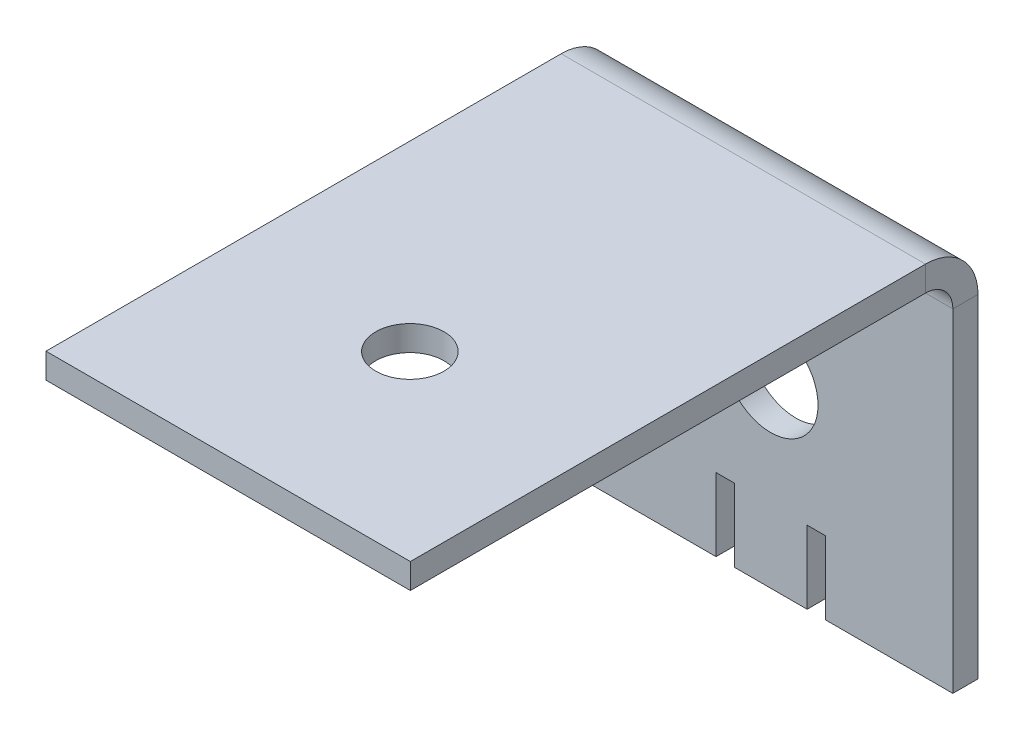
ISO-10303-21;
HEADER;
FILE_DESCRIPTION(('STEP AP214'),'2;1');
FILE_NAME('part.step','',(''),(''),'','','');
FILE_SCHEMA(('AUTOMOTIVE_DESIGN { 1 0 10303 214 1 1 1 1 }'));
ENDSEC;
DATA;
#1=APPLICATION_CONTEXT('core data for automotive mechanical design processes');
#2=APPLICATION_PROTOCOL_DEFINITION('international standard','automotive_design',2000,#1);
#3=PRODUCT_CONTEXT('',#1,'mechanical');
#4=PRODUCT('Part','Part','',(#3));
#5=PRODUCT_RELATED_PRODUCT_CATEGORY('part','',(#4));
#6=PRODUCT_DEFINITION_FORMATION('','',#4);
#7=PRODUCT_DEFINITION_CONTEXT('part definition',#1,'design');
#8=PRODUCT_DEFINITION('design','',#6,#7);
#9=PRODUCT_DEFINITION_SHAPE('','',#8);
#10=(LENGTH_UNIT() NAMED_UNIT(*) SI_UNIT(.MILLI.,.METRE.));
#11=(NAMED_UNIT(*) PLANE_ANGLE_UNIT() SI_UNIT($,.RADIAN.));
#12=(NAMED_UNIT(*) SI_UNIT($,.STERADIAN.) SOLID_ANGLE_UNIT());
#13=UNCERTAINTY_MEASURE_WITH_UNIT(LENGTH_MEASURE(1.E-05),#10,'distance_accuracy_value','');
#14=(GEOMETRIC_REPRESENTATION_CONTEXT(3) GLOBAL_UNCERTAINTY_ASSIGNED_CONTEXT((#13)) GLOBAL_UNIT_ASSIGNED_CONTEXT((#10,
#11,#12)) REPRESENTATION_CONTEXT('',''));
#15=CARTESIAN_POINT('',(0.,0.,0.));
#16=DIRECTION('',(0.,0.,1.));
#17=DIRECTION('',(1.,0.,0.));
#18=AXIS2_PLACEMENT_3D('',#15,#16,#17);
#19=CARTESIAN_POINT('',(0.,0.,-1.7526));
#20=DIRECTION('',(-1.,0.,0.));
#21=DIRECTION('',(0.,0.,1.));
#22=AXIS2_PLACEMENT_3D('',#19,#20,#21);
#23=PLANE('',#22);
#24=DIRECTION('',(0.,0.,1.));
#25=VECTOR('',#24,1.);
#26=CARTESIAN_POINT('',(0.,15.24,-8.93680489685532));
#27=LINE('',#26,#25);
#28=CARTESIAN_POINT('',(0.,15.24,-1.7526));
#29=VERTEX_POINT('',#28);
#30=CARTESIAN_POINT('',(0.,15.24,0.));
#31=VERTEX_POINT('',#30);
#32=EDGE_CURVE('E208',#29,#31,#27,.T.);
#33=ORIENTED_EDGE('',*,*,#32,.T.);
#34=DIRECTION('',(0.,-1.,0.));
#35=VECTOR('',#34,1.);
#36=CARTESIAN_POINT('',(0.,0.,0.));
#37=LINE('',#36,#35);
#38=CARTESIAN_POINT('',(0.,23.2155720881427,0.));
#39=VERTEX_POINT('',#38);
#40=EDGE_CURVE('E307',#39,#31,#37,.T.);
#41=ORIENTED_EDGE('',*,*,#40,.F.);
#42=DIRECTION('',(0.,0.,-1.));
#43=VECTOR('',#42,1.);
#44=CARTESIAN_POINT('',(0.,23.2155720881427,-1.75259999999984));
#45=LINE('',#44,#43);
#46=CARTESIAN_POINT('',(0.,23.2155720881427,-1.7526));
#47=VERTEX_POINT('',#46);
#48=EDGE_CURVE('E297',#39,#47,#45,.T.);
#49=ORIENTED_EDGE('',*,*,#48,.T.);
#50=DIRECTION('',(0.,-1.,0.));
#51=VECTOR('',#50,1.);
#52=CARTESIAN_POINT('',(0.,0.,-1.7526));
#53=LINE('',#52,#51);
#54=EDGE_CURVE('E70',#47,#29,#53,.T.);
#55=ORIENTED_EDGE('',*,*,#54,.T.);
#56=EDGE_LOOP('',(#33,#41,#49,#55));
#57=FACE_BOUND('',#56,.T.);
#58=ADVANCED_FACE('F45',(#57),#23,.T.);
#59=CARTESIAN_POINT('',(0.,0.,-1.7526));
#60=DIRECTION('',(0.,-1.,0.));
#61=DIRECTION('',(0.,0.,-1.));
#62=AXIS2_PLACEMENT_3D('',#59,#60,#61);
#63=PLANE('',#62);
#64=DIRECTION('',(0.,0.,1.));
#65=VECTOR('',#64,1.);
#66=CARTESIAN_POINT('',(10.16,0.,-1.7536));
#67=LINE('',#66,#65);
#68=CARTESIAN_POINT('',(10.16,0.,-1.7526));
#69=VERTEX_POINT('',#68);
#70=CARTESIAN_POINT('',(10.16,0.,0.));
#71=VERTEX_POINT('',#70);
#72=EDGE_CURVE('E234',#69,#71,#67,.T.);
#73=ORIENTED_EDGE('',*,*,#72,.F.);
#74=DIRECTION('',(1.,0.,0.));
#75=VECTOR('',#74,1.);
#76=CARTESIAN_POINT('',(0.,0.,-1.7526));
#77=LINE('',#76,#75);
#78=CARTESIAN_POINT('',(15.24,0.,-1.7526));
#79=VERTEX_POINT('',#78);
#80=EDGE_CURVE('E326',#69,#79,#77,.T.);
#81=ORIENTED_EDGE('',*,*,#80,.T.);
#82=DIRECTION('',(0.,0.,1.));
#83=VECTOR('',#82,1.);
#84=CARTESIAN_POINT('',(15.24,0.,-1.7536));
#85=LINE('',#84,#83);
#86=CARTESIAN_POINT('',(15.24,0.,0.));
#87=VERTEX_POINT('',#86);
#88=EDGE_CURVE('E264',#79,#87,#85,.T.);
#89=ORIENTED_EDGE('',*,*,#88,.T.);
#90=DIRECTION('',(1.,0.,0.));
#91=VECTOR('',#90,1.);
#92=CARTESIAN_POINT('',(0.,0.,0.));
#93=LINE('',#92,#91);
#94=EDGE_CURVE('E305',#71,#87,#93,.T.);
#95=ORIENTED_EDGE('',*,*,#94,.F.);
#96=EDGE_LOOP('',(#73,#81,#89,#95));
#97=FACE_BOUND('',#96,.T.);
#98=ADVANCED_FACE('F392',(#97),#63,.T.);
#99=DIRECTION('',(0.,0.,1.));
#100=VECTOR('',#99,1.);
#101=CARTESIAN_POINT('',(16.51,0.,-1.7536));
#102=LINE('',#101,#100);
#103=CARTESIAN_POINT('',(16.51,0.,-1.7526));
#104=VERTEX_POINT('',#103);
#105=CARTESIAN_POINT('',(16.51,0.,0.));
#106=VERTEX_POINT('',#105);
#107=EDGE_CURVE('E261',#104,#106,#102,.T.);
#108=ORIENTED_EDGE('',*,*,#107,.F.);
#109=CARTESIAN_POINT('',(25.4,0.,-1.7526));
#110=VERTEX_POINT('',#109);
#111=EDGE_CURVE('E327',#104,#110,#77,.T.);
#112=ORIENTED_EDGE('',*,*,#111,.T.);
#113=DIRECTION('',(0.,0.,1.));
#114=VECTOR('',#113,1.);
#115=CARTESIAN_POINT('',(25.4,0.,-1.7526));
#116=LINE('',#115,#114);
#117=CARTESIAN_POINT('',(25.4,0.,0.));
#118=VERTEX_POINT('',#117);
#119=EDGE_CURVE('E320',#110,#118,#116,.T.);
#120=ORIENTED_EDGE('',*,*,#119,.T.);
#121=EDGE_CURVE('E306',#106,#118,#93,.T.);
#122=ORIENTED_EDGE('',*,*,#121,.F.);
#123=EDGE_LOOP('',(#108,#112,#120,#122));
#124=FACE_BOUND('',#123,.T.);
#125=ADVANCED_FACE('F404',(#124),#63,.T.);
#126=CARTESIAN_POINT('',(0.,25.1205720881428,-25.6794279118573));
#127=DIRECTION('',(0.,1.,0.));
#128=DIRECTION('',(-1.,0.,0.));
#129=AXIS2_PLACEMENT_3D('',#126,#127,#128);
#130=PLANE('',#129);
#131=CARTESIAN_POINT('',(12.7,25.1205720881426,25.154382));
#132=DIRECTION('',(0.,1.,0.));
#133=DIRECTION('',(0.,0.,1.));
#134=AXIS2_PLACEMENT_3D('',#131,#132,#133);
#135=CIRCLE('',#134,2.38125);
#136=CARTESIAN_POINT('',(12.7,25.1205720881426,27.535632));
#137=VERTEX_POINT('',#136);
#138=EDGE_CURVE('E423',#137,#137,#135,.F.);
#139=ORIENTED_EDGE('',*,*,#138,.F.);
#140=EDGE_LOOP('',(#139));
#141=FACE_BOUND('',#140,.T.);
#142=DIRECTION('',(0.,0.,-1.));
#143=VECTOR('',#142,1.);
#144=CARTESIAN_POINT('',(0.,25.1205720881428,-25.6794279118573));
#145=LINE('',#144,#143);
#146=CARTESIAN_POINT('',(0.,25.1205720881426,37.8205720881427));
#147=VERTEX_POINT('',#146);
#148=CARTESIAN_POINT('',(0.,25.1205720881427,1.90499999999999));
#149=VERTEX_POINT('',#148);
#150=EDGE_CURVE('E294',#147,#149,#145,.T.);
#151=ORIENTED_EDGE('',*,*,#150,.T.);
#152=DIRECTION('',(1.,0.,0.));
#153=VECTOR('',#152,1.);
#154=CARTESIAN_POINT('',(0.,25.1205720881427,1.90499999999999));
#155=LINE('',#154,#153);
#156=CARTESIAN_POINT('',(25.4,25.1205720881427,1.90499999999999));
#157=VERTEX_POINT('',#156);
#158=EDGE_CURVE('E54',#149,#157,#155,.T.);
#159=ORIENTED_EDGE('',*,*,#158,.T.);
#160=DIRECTION('',(0.,0.,1.));
#161=VECTOR('',#160,1.);
#162=CARTESIAN_POINT('',(25.4,25.1205720881428,-25.6794279118573));
#163=LINE('',#162,#161);
#164=CARTESIAN_POINT('',(25.4,25.1205720881426,37.8205720881427));
#165=VERTEX_POINT('',#164);
#166=EDGE_CURVE('E338',#157,#165,#163,.T.);
#167=ORIENTED_EDGE('',*,*,#166,.T.);
#168=DIRECTION('',(-1.,0.,0.));
#169=VECTOR('',#168,1.);
#170=CARTESIAN_POINT('',(0.,25.1205720881426,37.8205720881427));
#171=LINE('',#170,#169);
#172=EDGE_CURVE('E334',#165,#147,#171,.T.);
#173=ORIENTED_EDGE('',*,*,#172,.T.);
#174=EDGE_LOOP('',(#151,#159,#167,#173));
#175=FACE_BOUND('',#174,.T.);
#176=ADVANCED_FACE('F356',(#141,#175),#130,.F.);
#177=CARTESIAN_POINT('',(0.,26.8731720881428,-25.6794279118573));
#178=DIRECTION('',(-1.,0.,0.));
#179=DIRECTION('',(0.,-1.,0.));
#180=AXIS2_PLACEMENT_3D('',#177,#178,#179);
#181=PLANE('',#180);
#182=DIRECTION('',(0.,1.,0.));
#183=VECTOR('',#182,1.);
#184=CARTESIAN_POINT('',(0.,26.8731720881425,1.90500000000001));
#185=LINE('',#184,#183);
#186=CARTESIAN_POINT('',(0.,26.8731720881427,1.90500000000001));
#187=VERTEX_POINT('',#186);
#188=EDGE_CURVE('E12',#149,#187,#185,.T.);
#189=ORIENTED_EDGE('',*,*,#188,.F.);
#190=ORIENTED_EDGE('',*,*,#150,.F.);
#191=DIRECTION('',(0.,-1.,0.));
#192=VECTOR('',#191,1.);
#193=CARTESIAN_POINT('',(0.,26.8731720881426,37.8205720881427));
#194=LINE('',#193,#192);
#195=CARTESIAN_POINT('',(0.,26.8731720881426,37.8205720881427));
#196=VERTEX_POINT('',#195);
#197=EDGE_CURVE('E339',#196,#147,#194,.T.);
#198=ORIENTED_EDGE('',*,*,#197,.F.);
#199=DIRECTION('',(0.,0.,-1.));
#200=VECTOR('',#199,1.);
#201=CARTESIAN_POINT('',(0.,26.8731720881428,-25.6794279118573));
#202=LINE('',#201,#200);
#203=EDGE_CURVE('E337',#196,#187,#202,.T.);
#204=ORIENTED_EDGE('',*,*,#203,.T.);
#205=EDGE_LOOP('',(#189,#190,#198,#204));
#206=FACE_BOUND('',#205,.T.);
#207=ADVANCED_FACE('F47',(#206),#181,.T.);
#208=CARTESIAN_POINT('',(0.,26.8731720881426,37.8205720881427));
#209=DIRECTION('',(0.,0.,1.));
#210=DIRECTION('',(0.,-1.,0.));
#211=AXIS2_PLACEMENT_3D('',#208,#209,#210);
#212=PLANE('',#211);
#213=ORIENTED_EDGE('',*,*,#172,.F.);
#214=DIRECTION('',(0.,-1.,0.));
#215=VECTOR('',#214,1.);
#216=CARTESIAN_POINT('',(25.4,26.8731720881426,37.8205720881427));
#217=LINE('',#216,#215);
#218=CARTESIAN_POINT('',(25.4,26.8731720881426,37.8205720881427));
#219=VERTEX_POINT('',#218);
#220=EDGE_CURVE('E333',#219,#165,#217,.T.);
#221=ORIENTED_EDGE('',*,*,#220,.F.);
#222=DIRECTION('',(-1.,0.,0.));
#223=VECTOR('',#222,1.);
#224=CARTESIAN_POINT('',(0.,26.8731720881426,37.8205720881427));
#225=LINE('',#224,#223);
#226=EDGE_CURVE('E330',#219,#196,#225,.T.);
#227=ORIENTED_EDGE('',*,*,#226,.T.);
#228=ORIENTED_EDGE('',*,*,#197,.T.);
#229=EDGE_LOOP('',(#213,#221,#227,#228));
#230=FACE_BOUND('',#229,.T.);
#231=ADVANCED_FACE('F444',(#230),#212,.T.);
#232=CARTESIAN_POINT('',(25.4,26.8731720881428,-25.6794279118573));
#233=DIRECTION('',(1.,0.,0.));
#234=DIRECTION('',(0.,1.,0.));
#235=AXIS2_PLACEMENT_3D('',#232,#233,#234);
#236=PLANE('',#235);
#237=DIRECTION('',(0.,-1.,0.));
#238=VECTOR('',#237,1.);
#239=CARTESIAN_POINT('',(25.4,26.8731720881425,1.90500000000001));
#240=LINE('',#239,#238);
#241=CARTESIAN_POINT('',(25.4,26.8731720881427,1.90500000000002));
#242=VERTEX_POINT('',#241);
#243=EDGE_CURVE('E346',#242,#157,#240,.T.);
#244=ORIENTED_EDGE('',*,*,#243,.F.);
#245=DIRECTION('',(0.,0.,1.));
#246=VECTOR('',#245,1.);
#247=CARTESIAN_POINT('',(25.4,26.8731720881428,-25.6794279118573));
#248=LINE('',#247,#246);
#249=EDGE_CURVE('E49',#242,#219,#248,.T.);
#250=ORIENTED_EDGE('',*,*,#249,.T.);
#251=ORIENTED_EDGE('',*,*,#220,.T.);
#252=ORIENTED_EDGE('',*,*,#166,.F.);
#253=EDGE_LOOP('',(#244,#250,#251,#252));
#254=FACE_BOUND('',#253,.T.);
#255=ADVANCED_FACE('F437',(#254),#236,.T.);
#256=CARTESIAN_POINT('',(0.,26.8731720881428,-25.6794279118573));
#257=DIRECTION('',(0.,1.,0.));
#258=DIRECTION('',(-1.,0.,0.));
#259=AXIS2_PLACEMENT_3D('',#256,#257,#258);
#260=PLANE('',#259);
#261=CARTESIAN_POINT('',(12.7,26.8731720881426,25.154382));
#262=DIRECTION('',(0.,1.,0.));
#263=DIRECTION('',(0.,0.,1.));
#264=AXIS2_PLACEMENT_3D('',#261,#262,#263);
#265=CIRCLE('',#264,2.38125);
#266=CARTESIAN_POINT('',(12.7,26.8731720881426,27.535632));
#267=VERTEX_POINT('',#266);
#268=EDGE_CURVE('E427',#267,#267,#265,.T.);
#269=ORIENTED_EDGE('',*,*,#268,.F.);
#270=EDGE_LOOP('',(#269));
#271=FACE_BOUND('',#270,.T.);
#272=DIRECTION('',(1.,0.,0.));
#273=VECTOR('',#272,1.);
#274=CARTESIAN_POINT('',(0.,26.8731720881427,1.90500000000001));
#275=LINE('',#274,#273);
#276=EDGE_CURVE('E341',#187,#242,#275,.T.);
#277=ORIENTED_EDGE('',*,*,#276,.F.);
#278=ORIENTED_EDGE('',*,*,#203,.F.);
#279=ORIENTED_EDGE('',*,*,#226,.F.);
#280=ORIENTED_EDGE('',*,*,#249,.F.);
#281=EDGE_LOOP('',(#277,#278,#279,#280));
#282=FACE_BOUND('',#281,.T.);
#283=ADVANCED_FACE('F434',(#271,#282),#260,.T.);
#284=DIRECTION('',(0.,0.,1.));
#285=VECTOR('',#284,1.);
#286=CARTESIAN_POINT('',(8.89,0.,-1.7536));
#287=LINE('',#286,#285);
#288=CARTESIAN_POINT('',(8.89,0.,-1.7526));
#289=VERTEX_POINT('',#288);
#290=CARTESIAN_POINT('',(8.89,0.,0.));
#291=VERTEX_POINT('',#290);
#292=EDGE_CURVE('E237',#289,#291,#287,.T.);
#293=ORIENTED_EDGE('',*,*,#292,.T.);
#294=CARTESIAN_POINT('',(0.,0.,0.));
#295=VERTEX_POINT('',#294);
#296=EDGE_CURVE('E302',#295,#291,#93,.T.);
#297=ORIENTED_EDGE('',*,*,#296,.F.);
#298=DIRECTION('',(0.,0.,1.));
#299=VECTOR('',#298,1.);
#300=CARTESIAN_POINT('',(0.,0.,-1.7526));
#301=LINE('',#300,#299);
#302=CARTESIAN_POINT('',(0.,0.,-1.7526));
#303=VERTEX_POINT('',#302);
#304=EDGE_CURVE('E291',#303,#295,#301,.T.);
#305=ORIENTED_EDGE('',*,*,#304,.F.);
#306=EDGE_CURVE('E323',#303,#289,#77,.T.);
#307=ORIENTED_EDGE('',*,*,#306,.T.);
#308=EDGE_LOOP('',(#293,#297,#305,#307));
#309=FACE_BOUND('',#308,.T.);
#310=ADVANCED_FACE('F417',(#309),#63,.T.);
#311=CARTESIAN_POINT('',(0.,0.,-1.7526));
#312=DIRECTION('',(0.,0.,-1.));
#313=DIRECTION('',(-1.,0.,0.));
#314=AXIS2_PLACEMENT_3D('',#311,#312,#313);
#315=PLANE('',#314);
#316=DIRECTION('',(0.,1.,0.));
#317=VECTOR('',#316,1.);
#318=CARTESIAN_POINT('',(10.16,0.,-1.7526));
#319=LINE('',#318,#317);
#320=CARTESIAN_POINT('',(10.16,5.08,-1.7526));
#321=VERTEX_POINT('',#320);
#322=EDGE_CURVE('E224',#69,#321,#319,.T.);
#323=ORIENTED_EDGE('',*,*,#322,.T.);
#324=DIRECTION('',(-1.,0.,0.));
#325=VECTOR('',#324,1.);
#326=CARTESIAN_POINT('',(10.16,5.08,-1.7526));
#327=LINE('',#326,#325);
#328=CARTESIAN_POINT('',(8.89,5.08,-1.7526));
#329=VERTEX_POINT('',#328);
#330=EDGE_CURVE('E236',#321,#329,#327,.T.);
#331=ORIENTED_EDGE('',*,*,#330,.T.);
#332=DIRECTION('',(0.,-1.,0.));
#333=VECTOR('',#332,1.);
#334=CARTESIAN_POINT('',(8.89,0.,-1.7526));
#335=LINE('',#334,#333);
#336=EDGE_CURVE('E221',#329,#289,#335,.T.);
#337=ORIENTED_EDGE('',*,*,#336,.T.);
#338=ORIENTED_EDGE('',*,*,#306,.F.);
#339=CARTESIAN_POINT('',(0.,10.16,-1.7526));
#340=VERTEX_POINT('',#339);
#341=EDGE_CURVE('E296',#340,#303,#53,.T.);
#342=ORIENTED_EDGE('',*,*,#341,.F.);
#343=DIRECTION('',(1.,0.,0.));
#344=VECTOR('',#343,1.);
#345=CARTESIAN_POINT('',(-5.08,10.16,-1.7526));
#346=LINE('',#345,#344);
#347=CARTESIAN_POINT('',(-5.08,10.16,-1.7526));
#348=VERTEX_POINT('',#347);
#349=EDGE_CURVE('E193',#348,#340,#346,.T.);
#350=ORIENTED_EDGE('',*,*,#349,.F.);
#351=DIRECTION('',(0.,-1.,0.));
#352=VECTOR('',#351,1.);
#353=CARTESIAN_POINT('',(-5.08,15.24,-1.7526));
#354=LINE('',#353,#352);
#355=CARTESIAN_POINT('',(-5.08,15.24,-1.7526));
#356=VERTEX_POINT('',#355);
#357=EDGE_CURVE('E184',#356,#348,#354,.T.);
#358=ORIENTED_EDGE('',*,*,#357,.F.);
#359=DIRECTION('',(-1.,0.,0.));
#360=VECTOR('',#359,1.);
#361=CARTESIAN_POINT('',(-5.08,15.24,-1.7526));
#362=LINE('',#361,#360);
#363=EDGE_CURVE('E190',#29,#356,#362,.T.);
#364=ORIENTED_EDGE('',*,*,#363,.F.);
#365=ORIENTED_EDGE('',*,*,#54,.F.);
#366=DIRECTION('',(1.,0.,0.));
#367=VECTOR('',#366,1.);
#368=CARTESIAN_POINT('',(0.,23.2155720881427,-1.7526));
#369=LINE('',#368,#367);
#370=CARTESIAN_POINT('',(25.4,23.2155720881427,-1.7526));
#371=VERTEX_POINT('',#370);
#372=EDGE_CURVE('E317',#47,#371,#369,.T.);
#373=ORIENTED_EDGE('',*,*,#372,.T.);
#374=DIRECTION('',(0.,1.,0.));
#375=VECTOR('',#374,1.);
#376=CARTESIAN_POINT('',(25.4,0.,-1.7526));
#377=LINE('',#376,#375);
#378=EDGE_CURVE('E314',#110,#371,#377,.T.);
#379=ORIENTED_EDGE('',*,*,#378,.F.);
#380=ORIENTED_EDGE('',*,*,#111,.F.);
#381=DIRECTION('',(0.,1.,0.));
#382=VECTOR('',#381,1.);
#383=CARTESIAN_POINT('',(16.51,0.,-1.7526));
#384=LINE('',#383,#382);
#385=CARTESIAN_POINT('',(16.51,5.08,-1.7526));
#386=VERTEX_POINT('',#385);
#387=EDGE_CURVE('E249',#104,#386,#384,.T.);
#388=ORIENTED_EDGE('',*,*,#387,.T.);
#389=DIRECTION('',(-1.,0.,0.));
#390=VECTOR('',#389,1.);
#391=CARTESIAN_POINT('',(16.51,5.08,-1.7526));
#392=LINE('',#391,#390);
#393=CARTESIAN_POINT('',(15.24,5.08,-1.7526));
#394=VERTEX_POINT('',#393);
#395=EDGE_CURVE('E263',#386,#394,#392,.T.);
#396=ORIENTED_EDGE('',*,*,#395,.T.);
#397=DIRECTION('',(0.,-1.,0.));
#398=VECTOR('',#397,1.);
#399=CARTESIAN_POINT('',(15.24,0.,-1.7526));
#400=LINE('',#399,#398);
#401=EDGE_CURVE('E246',#394,#79,#400,.T.);
#402=ORIENTED_EDGE('',*,*,#401,.T.);
#403=ORIENTED_EDGE('',*,*,#80,.F.);
#404=EDGE_LOOP('',(#323,#331,#337,#338,#342,#350,#358,#364,#365,#373,#379,#380,#388,#396,#402,#403));
#405=FACE_BOUND('',#404,.T.);
#406=CARTESIAN_POINT('',(12.7,12.7,-1.7526));
#407=DIRECTION('',(0.,0.,-1.));
#408=DIRECTION('',(-1.,0.,0.));
#409=AXIS2_PLACEMENT_3D('',#406,#407,#408);
#410=CIRCLE('',#409,3.302);
#411=CARTESIAN_POINT('',(9.398,12.7,-1.7526));
#412=VERTEX_POINT('',#411);
#413=EDGE_CURVE('E273',#412,#412,#410,.F.);
#414=ORIENTED_EDGE('',*,*,#413,.T.);
#415=EDGE_LOOP('',(#414));
#416=FACE_BOUND('',#415,.T.);
#417=ADVANCED_FACE('F187',(#405,#416),#315,.T.);
#418=CARTESIAN_POINT('',(25.4,0.,-1.7526));
#419=DIRECTION('',(1.,0.,0.));
#420=DIRECTION('',(0.,0.,-1.));
#421=AXIS2_PLACEMENT_3D('',#418,#419,#420);
#422=PLANE('',#421);
#423=ORIENTED_EDGE('',*,*,#378,.T.);
#424=DIRECTION('',(0.,0.,1.));
#425=VECTOR('',#424,1.);
#426=CARTESIAN_POINT('',(25.4,23.2155720881427,-1.75259999999984));
#427=LINE('',#426,#425);
#428=CARTESIAN_POINT('',(25.4,23.2155720881427,0.));
#429=VERTEX_POINT('',#428);
#430=EDGE_CURVE('E311',#371,#429,#427,.T.);
#431=ORIENTED_EDGE('',*,*,#430,.T.);
#432=DIRECTION('',(0.,1.,0.));
#433=VECTOR('',#432,1.);
#434=CARTESIAN_POINT('',(25.4,0.,0.));
#435=LINE('',#434,#433);
#436=EDGE_CURVE('E299',#118,#429,#435,.T.);
#437=ORIENTED_EDGE('',*,*,#436,.F.);
#438=ORIENTED_EDGE('',*,*,#119,.F.);
#439=EDGE_LOOP('',(#423,#431,#437,#438));
#440=FACE_BOUND('',#439,.T.);
#441=ADVANCED_FACE('F378',(#440),#422,.T.);
#442=CARTESIAN_POINT('',(0.,0.,0.));
#443=DIRECTION('',(0.,0.,-1.));
#444=DIRECTION('',(-1.,0.,0.));
#445=AXIS2_PLACEMENT_3D('',#442,#443,#444);
#446=PLANE('',#445);
#447=CARTESIAN_POINT('',(12.7,12.7,0.));
#448=DIRECTION('',(0.,0.,1.));
#449=DIRECTION('',(1.,0.,0.));
#450=AXIS2_PLACEMENT_3D('',#447,#448,#449);
#451=CIRCLE('',#450,3.302);
#452=CARTESIAN_POINT('',(16.002,12.7,0.));
#453=VERTEX_POINT('',#452);
#454=EDGE_CURVE('E274',#453,#453,#451,.T.);
#455=ORIENTED_EDGE('',*,*,#454,.F.);
#456=EDGE_LOOP('',(#455));
#457=FACE_BOUND('',#456,.T.);
#458=DIRECTION('',(-1.,0.,0.));
#459=VECTOR('',#458,1.);
#460=CARTESIAN_POINT('',(10.16,5.08,0.));
#461=LINE('',#460,#459);
#462=CARTESIAN_POINT('',(10.16,5.08,0.));
#463=VERTEX_POINT('',#462);
#464=CARTESIAN_POINT('',(8.89,5.08,0.));
#465=VERTEX_POINT('',#464);
#466=EDGE_CURVE('E228',#463,#465,#461,.T.);
#467=ORIENTED_EDGE('',*,*,#466,.F.);
#468=DIRECTION('',(0.,1.,0.));
#469=VECTOR('',#468,1.);
#470=CARTESIAN_POINT('',(10.16,0.,0.));
#471=LINE('',#470,#469);
#472=EDGE_CURVE('E226',#71,#463,#471,.T.);
#473=ORIENTED_EDGE('',*,*,#472,.F.);
#474=ORIENTED_EDGE('',*,*,#94,.T.);
#475=DIRECTION('',(0.,-1.,0.));
#476=VECTOR('',#475,1.);
#477=CARTESIAN_POINT('',(15.24,0.,0.));
#478=LINE('',#477,#476);
#479=CARTESIAN_POINT('',(15.24,5.08,0.));
#480=VERTEX_POINT('',#479);
#481=EDGE_CURVE('E257',#480,#87,#478,.T.);
#482=ORIENTED_EDGE('',*,*,#481,.F.);
#483=DIRECTION('',(-1.,0.,0.));
#484=VECTOR('',#483,1.);
#485=CARTESIAN_POINT('',(16.51,5.08,0.));
#486=LINE('',#485,#484);
#487=CARTESIAN_POINT('',(16.51,5.08,0.));
#488=VERTEX_POINT('',#487);
#489=EDGE_CURVE('E254',#488,#480,#486,.T.);
#490=ORIENTED_EDGE('',*,*,#489,.F.);
#491=DIRECTION('',(0.,1.,0.));
#492=VECTOR('',#491,1.);
#493=CARTESIAN_POINT('',(16.51,0.,0.));
#494=LINE('',#493,#492);
#495=EDGE_CURVE('E252',#106,#488,#494,.T.);
#496=ORIENTED_EDGE('',*,*,#495,.F.);
#497=ORIENTED_EDGE('',*,*,#121,.T.);
#498=ORIENTED_EDGE('',*,*,#436,.T.);
#499=DIRECTION('',(1.,0.,0.));
#500=VECTOR('',#499,1.);
#501=CARTESIAN_POINT('',(0.,23.2155720881427,0.));
#502=LINE('',#501,#500);
#503=EDGE_CURVE('E287',#39,#429,#502,.T.);
#504=ORIENTED_EDGE('',*,*,#503,.F.);
#505=ORIENTED_EDGE('',*,*,#40,.T.);
#506=DIRECTION('',(-1.,0.,0.));
#507=VECTOR('',#506,1.);
#508=CARTESIAN_POINT('',(-5.08,15.24,0.));
#509=LINE('',#508,#507);
#510=CARTESIAN_POINT('',(-5.08,15.24,0.));
#511=VERTEX_POINT('',#510);
#512=EDGE_CURVE('E215',#31,#511,#509,.T.);
#513=ORIENTED_EDGE('',*,*,#512,.T.);
#514=DIRECTION('',(0.,-1.,0.));
#515=VECTOR('',#514,1.);
#516=CARTESIAN_POINT('',(-5.08,15.24,0.));
#517=LINE('',#516,#515);
#518=CARTESIAN_POINT('',(-5.08,10.16,0.));
#519=VERTEX_POINT('',#518);
#520=EDGE_CURVE('E202',#511,#519,#517,.T.);
#521=ORIENTED_EDGE('',*,*,#520,.T.);
#522=DIRECTION('',(1.,0.,0.));
#523=VECTOR('',#522,1.);
#524=CARTESIAN_POINT('',(-5.08,10.16,0.));
#525=LINE('',#524,#523);
#526=CARTESIAN_POINT('',(0.,10.16,0.));
#527=VERTEX_POINT('',#526);
#528=EDGE_CURVE('E209',#519,#527,#525,.T.);
#529=ORIENTED_EDGE('',*,*,#528,.T.);
#530=EDGE_CURVE('E310',#527,#295,#37,.T.);
#531=ORIENTED_EDGE('',*,*,#530,.T.);
#532=ORIENTED_EDGE('',*,*,#296,.T.);
#533=DIRECTION('',(0.,-1.,0.));
#534=VECTOR('',#533,1.);
#535=CARTESIAN_POINT('',(8.89,0.,0.));
#536=LINE('',#535,#534);
#537=EDGE_CURVE('E231',#465,#291,#536,.T.);
#538=ORIENTED_EDGE('',*,*,#537,.F.);
#539=EDGE_LOOP('',(#467,#473,#474,#482,#490,#496,#497,#498,#504,#505,#513,#521,#529,#531,#532,#538));
#540=FACE_BOUND('',#539,.T.);
#541=ADVANCED_FACE('F372',(#457,#540),#446,.F.);
#542=DIRECTION('',(0.,0.,1.));
#543=VECTOR('',#542,1.);
#544=CARTESIAN_POINT('',(0.,10.16,-8.93680489685532));
#545=LINE('',#544,#543);
#546=EDGE_CURVE('E62',#340,#527,#545,.T.);
#547=ORIENTED_EDGE('',*,*,#546,.F.);
#548=ORIENTED_EDGE('',*,*,#341,.T.);
#549=ORIENTED_EDGE('',*,*,#304,.T.);
#550=ORIENTED_EDGE('',*,*,#530,.F.);
#551=EDGE_LOOP('',(#547,#548,#549,#550));
#552=FACE_BOUND('',#551,.T.);
#553=ADVANCED_FACE('F419',(#552),#23,.T.);
#554=CARTESIAN_POINT('',(0.,23.2155720881427,1.905));
#555=DIRECTION('',(-1.,0.,0.));
#556=DIRECTION('',(0.,0.,1.));
#557=AXIS2_PLACEMENT_3D('',#554,#555,#556);
#558=PLANE('',#557);
#559=ORIENTED_EDGE('',*,*,#48,.F.);
#560=CARTESIAN_POINT('',(0.,23.2155720881427,1.905));
#561=DIRECTION('',(1.,0.,0.));
#562=DIRECTION('',(0.,0.,-1.));
#563=AXIS2_PLACEMENT_3D('',#560,#561,#562);
#564=CIRCLE('',#563,1.905);
#565=EDGE_CURVE('E277',#39,#149,#564,.T.);
#566=ORIENTED_EDGE('',*,*,#565,.T.);
#567=ORIENTED_EDGE('',*,*,#188,.T.);
#568=CARTESIAN_POINT('',(0.,23.2155720881427,1.905));
#569=DIRECTION('',(1.,0.,0.));
#570=DIRECTION('',(0.,0.,1.));
#571=AXIS2_PLACEMENT_3D('',#568,#569,#570);
#572=CIRCLE('',#571,3.6576);
#573=EDGE_CURVE('E280',#47,#187,#572,.T.);
#574=ORIENTED_EDGE('',*,*,#573,.F.);
#575=EDGE_LOOP('',(#559,#566,#567,#574));
#576=FACE_BOUND('',#575,.T.);
#577=ADVANCED_FACE('F368',(#576),#558,.T.);
#578=CARTESIAN_POINT('',(25.4,23.2155720881427,1.905));
#579=DIRECTION('',(1.,0.,0.));
#580=DIRECTION('',(0.,0.,-1.));
#581=AXIS2_PLACEMENT_3D('',#578,#579,#580);
#582=PLANE('',#581);
#583=CARTESIAN_POINT('',(25.4,23.2155720881427,1.905));
#584=DIRECTION('',(1.,0.,0.));
#585=DIRECTION('',(0.,0.,-1.));
#586=AXIS2_PLACEMENT_3D('',#583,#584,#585);
#587=CIRCLE('',#586,1.905);
#588=EDGE_CURVE('E284',#157,#429,#587,.F.);
#589=ORIENTED_EDGE('',*,*,#588,.T.);
#590=ORIENTED_EDGE('',*,*,#430,.F.);
#591=CARTESIAN_POINT('',(25.4,23.2155720881427,1.905));
#592=DIRECTION('',(-1.,0.,0.));
#593=DIRECTION('',(0.,0.,-1.));
#594=AXIS2_PLACEMENT_3D('',#591,#592,#593);
#595=CIRCLE('',#594,3.6576);
#596=EDGE_CURVE('E283',#242,#371,#595,.T.);
#597=ORIENTED_EDGE('',*,*,#596,.F.);
#598=ORIENTED_EDGE('',*,*,#243,.T.);
#599=EDGE_LOOP('',(#589,#590,#597,#598));
#600=FACE_BOUND('',#599,.T.);
#601=ADVANCED_FACE('F382',(#600),#582,.T.);
#602=CARTESIAN_POINT('',(-13.1325087432174,23.2155720881427,1.905));
#603=DIRECTION('',(1.,0.,0.));
#604=DIRECTION('',(0.,0.,-1.));
#605=AXIS2_PLACEMENT_3D('',#602,#603,#604);
#606=CYLINDRICAL_SURFACE('',#605,3.6576);
#607=ORIENTED_EDGE('',*,*,#276,.T.);
#608=ORIENTED_EDGE('',*,*,#596,.T.);
#609=ORIENTED_EDGE('',*,*,#372,.F.);
#610=ORIENTED_EDGE('',*,*,#573,.T.);
#611=EDGE_LOOP('',(#607,#608,#609,#610));
#612=FACE_BOUND('',#611,.T.);
#613=ADVANCED_FACE('F384',(#612),#606,.T.);
#614=CARTESIAN_POINT('',(-13.1325087432174,23.2155720881427,1.905));
#615=DIRECTION('',(1.,0.,0.));
#616=DIRECTION('',(0.,0.,-1.));
#617=AXIS2_PLACEMENT_3D('',#614,#615,#616);
#618=CYLINDRICAL_SURFACE('',#617,1.905);
#619=ORIENTED_EDGE('',*,*,#158,.F.);
#620=ORIENTED_EDGE('',*,*,#565,.F.);
#621=ORIENTED_EDGE('',*,*,#503,.T.);
#622=ORIENTED_EDGE('',*,*,#588,.F.);
#623=EDGE_LOOP('',(#619,#620,#621,#622));
#624=FACE_BOUND('',#623,.T.);
#625=ADVANCED_FACE('F366',(#624),#618,.F.);
#626=CARTESIAN_POINT('',(12.7,12.7,-1.7536));
#627=DIRECTION('',(0.,0.,1.));
#628=DIRECTION('',(1.,0.,0.));
#629=AXIS2_PLACEMENT_3D('',#626,#627,#628);
#630=CYLINDRICAL_SURFACE('',#629,3.302);
#631=ORIENTED_EDGE('',*,*,#413,.F.);
#632=EDGE_LOOP('',(#631));
#633=FACE_BOUND('',#632,.T.);
#634=ORIENTED_EDGE('',*,*,#454,.T.);
#635=EDGE_LOOP('',(#634));
#636=FACE_BOUND('',#635,.T.);
#637=ADVANCED_FACE('F479',(#633,#636),#630,.F.);
#638=CARTESIAN_POINT('',(16.51,0.,-1.7536));
#639=DIRECTION('',(1.,0.,0.));
#640=DIRECTION('',(0.,0.,-1.));
#641=AXIS2_PLACEMENT_3D('',#638,#639,#640);
#642=PLANE('',#641);
#643=ORIENTED_EDGE('',*,*,#107,.T.);
#644=ORIENTED_EDGE('',*,*,#495,.T.);
#645=DIRECTION('',(0.,0.,1.));
#646=VECTOR('',#645,1.);
#647=CARTESIAN_POINT('',(16.51,5.08,-1.7536));
#648=LINE('',#647,#646);
#649=EDGE_CURVE('E260',#386,#488,#648,.T.);
#650=ORIENTED_EDGE('',*,*,#649,.F.);
#651=ORIENTED_EDGE('',*,*,#387,.F.);
#652=EDGE_LOOP('',(#643,#644,#650,#651));
#653=FACE_BOUND('',#652,.T.);
#654=ADVANCED_FACE('F403',(#653),#642,.F.);
#655=CARTESIAN_POINT('',(15.24,0.,-1.7536));
#656=DIRECTION('',(-1.,0.,0.));
#657=DIRECTION('',(0.,0.,1.));
#658=AXIS2_PLACEMENT_3D('',#655,#656,#657);
#659=PLANE('',#658);
#660=DIRECTION('',(0.,0.,1.));
#661=VECTOR('',#660,1.);
#662=CARTESIAN_POINT('',(15.24,5.08,-1.7536));
#663=LINE('',#662,#661);
#664=EDGE_CURVE('E267',#394,#480,#663,.T.);
#665=ORIENTED_EDGE('',*,*,#664,.T.);
#666=ORIENTED_EDGE('',*,*,#481,.T.);
#667=ORIENTED_EDGE('',*,*,#88,.F.);
#668=ORIENTED_EDGE('',*,*,#401,.F.);
#669=EDGE_LOOP('',(#665,#666,#667,#668));
#670=FACE_BOUND('',#669,.T.);
#671=ADVANCED_FACE('F395',(#670),#659,.F.);
#672=CARTESIAN_POINT('',(16.51,5.08,-1.7536));
#673=DIRECTION('',(0.,1.,0.));
#674=DIRECTION('',(0.,0.,1.));
#675=AXIS2_PLACEMENT_3D('',#672,#673,#674);
#676=PLANE('',#675);
#677=ORIENTED_EDGE('',*,*,#649,.T.);
#678=ORIENTED_EDGE('',*,*,#489,.T.);
#679=ORIENTED_EDGE('',*,*,#664,.F.);
#680=ORIENTED_EDGE('',*,*,#395,.F.);
#681=EDGE_LOOP('',(#677,#678,#679,#680));
#682=FACE_BOUND('',#681,.T.);
#683=ADVANCED_FACE('F400',(#682),#676,.F.);
#684=CARTESIAN_POINT('',(10.16,0.,-1.7536));
#685=DIRECTION('',(1.,0.,0.));
#686=DIRECTION('',(0.,0.,-1.));
#687=AXIS2_PLACEMENT_3D('',#684,#685,#686);
#688=PLANE('',#687);
#689=ORIENTED_EDGE('',*,*,#72,.T.);
#690=ORIENTED_EDGE('',*,*,#472,.T.);
#691=DIRECTION('',(0.,0.,1.));
#692=VECTOR('',#691,1.);
#693=CARTESIAN_POINT('',(10.16,5.08,-1.7536));
#694=LINE('',#693,#692);
#695=EDGE_CURVE('E233',#321,#463,#694,.T.);
#696=ORIENTED_EDGE('',*,*,#695,.F.);
#697=ORIENTED_EDGE('',*,*,#322,.F.);
#698=EDGE_LOOP('',(#689,#690,#696,#697));
#699=FACE_BOUND('',#698,.T.);
#700=ADVANCED_FACE('F409',(#699),#688,.F.);
#701=CARTESIAN_POINT('',(8.89,0.,-1.7536));
#702=DIRECTION('',(-1.,0.,0.));
#703=DIRECTION('',(0.,0.,1.));
#704=AXIS2_PLACEMENT_3D('',#701,#702,#703);
#705=PLANE('',#704);
#706=DIRECTION('',(0.,0.,1.));
#707=VECTOR('',#706,1.);
#708=CARTESIAN_POINT('',(8.89,5.08,-1.7536));
#709=LINE('',#708,#707);
#710=EDGE_CURVE('E240',#329,#465,#709,.T.);
#711=ORIENTED_EDGE('',*,*,#710,.T.);
#712=ORIENTED_EDGE('',*,*,#537,.T.);
#713=ORIENTED_EDGE('',*,*,#292,.F.);
#714=ORIENTED_EDGE('',*,*,#336,.F.);
#715=EDGE_LOOP('',(#711,#712,#713,#714));
#716=FACE_BOUND('',#715,.T.);
#717=ADVANCED_FACE('F493',(#716),#705,.F.);
#718=CARTESIAN_POINT('',(10.16,5.08,-1.7536));
#719=DIRECTION('',(0.,1.,0.));
#720=DIRECTION('',(0.,0.,1.));
#721=AXIS2_PLACEMENT_3D('',#718,#719,#720);
#722=PLANE('',#721);
#723=ORIENTED_EDGE('',*,*,#695,.T.);
#724=ORIENTED_EDGE('',*,*,#466,.T.);
#725=ORIENTED_EDGE('',*,*,#710,.F.);
#726=ORIENTED_EDGE('',*,*,#330,.F.);
#727=EDGE_LOOP('',(#723,#724,#725,#726));
#728=FACE_BOUND('',#727,.T.);
#729=ADVANCED_FACE('F411',(#728),#722,.F.);
#730=CARTESIAN_POINT('',(-5.08,15.24,-8.93680489685532));
#731=DIRECTION('',(0.,1.,0.));
#732=DIRECTION('',(-1.,0.,0.));
#733=AXIS2_PLACEMENT_3D('',#730,#731,#732);
#734=PLANE('',#733);
#735=ORIENTED_EDGE('',*,*,#32,.F.);
#736=ORIENTED_EDGE('',*,*,#363,.T.);
#737=DIRECTION('',(0.,0.,1.));
#738=VECTOR('',#737,1.);
#739=CARTESIAN_POINT('',(-5.08,15.24,-8.93680489685532));
#740=LINE('',#739,#738);
#741=EDGE_CURVE('E197',#356,#511,#740,.T.);
#742=ORIENTED_EDGE('',*,*,#741,.T.);
#743=ORIENTED_EDGE('',*,*,#512,.F.);
#744=EDGE_LOOP('',(#735,#736,#742,#743));
#745=FACE_BOUND('',#744,.T.);
#746=ADVANCED_FACE('F207',(#745),#734,.T.);
#747=CARTESIAN_POINT('',(-5.08,15.24,-8.93680489685532));
#748=DIRECTION('',(-1.,0.,0.));
#749=DIRECTION('',(0.,0.,1.));
#750=AXIS2_PLACEMENT_3D('',#747,#748,#749);
#751=PLANE('',#750);
#752=ORIENTED_EDGE('',*,*,#741,.F.);
#753=ORIENTED_EDGE('',*,*,#357,.T.);
#754=DIRECTION('',(0.,0.,1.));
#755=VECTOR('',#754,1.);
#756=CARTESIAN_POINT('',(-5.08,10.16,-8.93680489685532));
#757=LINE('',#756,#755);
#758=EDGE_CURVE('E196',#348,#519,#757,.T.);
#759=ORIENTED_EDGE('',*,*,#758,.T.);
#760=ORIENTED_EDGE('',*,*,#520,.F.);
#761=EDGE_LOOP('',(#752,#753,#759,#760));
#762=FACE_BOUND('',#761,.T.);
#763=ADVANCED_FACE('F200',(#762),#751,.T.);
#764=CARTESIAN_POINT('',(-5.08,10.16,-8.93680489685532));
#765=DIRECTION('',(0.,-1.,0.));
#766=DIRECTION('',(0.,0.,-1.));
#767=AXIS2_PLACEMENT_3D('',#764,#765,#766);
#768=PLANE('',#767);
#769=ORIENTED_EDGE('',*,*,#758,.F.);
#770=ORIENTED_EDGE('',*,*,#349,.T.);
#771=ORIENTED_EDGE('',*,*,#546,.T.);
#772=ORIENTED_EDGE('',*,*,#528,.F.);
#773=EDGE_LOOP('',(#769,#770,#771,#772));
#774=FACE_BOUND('',#773,.T.);
#775=ADVANCED_FACE('F421',(#774),#768,.T.);
#776=CARTESIAN_POINT('',(12.7,-0.00100000000009468,25.1543819999999));
#777=DIRECTION('',(0.,1.,0.));
#778=DIRECTION('',(0.,0.,1.));
#779=AXIS2_PLACEMENT_3D('',#776,#777,#778);
#780=CYLINDRICAL_SURFACE('',#779,2.38125);
#781=ORIENTED_EDGE('',*,*,#268,.T.);
#782=EDGE_LOOP('',(#781));
#783=FACE_BOUND('',#782,.T.);
#784=ORIENTED_EDGE('',*,*,#138,.T.);
#785=EDGE_LOOP('',(#784));
#786=FACE_BOUND('',#785,.T.);
#787=ADVANCED_FACE('F431',(#783,#786),#780,.F.);
#788=CLOSED_SHELL('',(#58,#98,#125,#176,#207,#231,#255,#283,#310,#417,#441,#541,#553,#577,#601,
#613,#625,#637,#654,#671,#683,#700,#717,#729,#746,#763,#775,#787));
#789=MANIFOLD_SOLID_BREP('B2',#788);
#790=ADVANCED_BREP_SHAPE_REPRESENTATION('',(#18,#789),#14);
#791=SHAPE_DEFINITION_REPRESENTATION(#9,#790);
ENDSEC;
END-ISO-10303-21;
